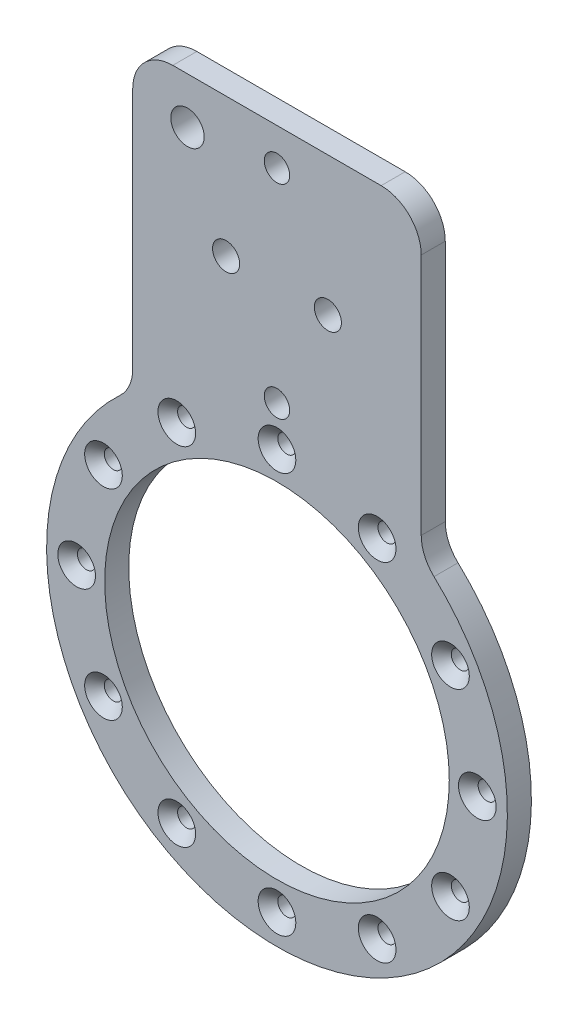
ISO-10303-21;
HEADER;
FILE_DESCRIPTION(('STEP AP214'),'2;1');
FILE_NAME('part.step','',(''),(''),'','','');
FILE_SCHEMA(('AUTOMOTIVE_DESIGN { 1 0 10303 214 1 1 1 1 }'));
ENDSEC;
DATA;
#1=APPLICATION_CONTEXT('core data for automotive mechanical design processes');
#2=APPLICATION_PROTOCOL_DEFINITION('international standard','automotive_design',2000,#1);
#3=PRODUCT_CONTEXT('',#1,'mechanical');
#4=PRODUCT('Part','Part','',(#3));
#5=PRODUCT_RELATED_PRODUCT_CATEGORY('part','',(#4));
#6=PRODUCT_DEFINITION_FORMATION('','',#4);
#7=PRODUCT_DEFINITION_CONTEXT('part definition',#1,'design');
#8=PRODUCT_DEFINITION('design','',#6,#7);
#9=PRODUCT_DEFINITION_SHAPE('','',#8);
#10=(LENGTH_UNIT() NAMED_UNIT(*) SI_UNIT(.MILLI.,.METRE.));
#11=(NAMED_UNIT(*) PLANE_ANGLE_UNIT() SI_UNIT($,.RADIAN.));
#12=(NAMED_UNIT(*) SI_UNIT($,.STERADIAN.) SOLID_ANGLE_UNIT());
#13=UNCERTAINTY_MEASURE_WITH_UNIT(LENGTH_MEASURE(1.E-05),#10,'distance_accuracy_value','');
#14=(GEOMETRIC_REPRESENTATION_CONTEXT(3) GLOBAL_UNCERTAINTY_ASSIGNED_CONTEXT((#13)) GLOBAL_UNIT_ASSIGNED_CONTEXT((#10,
#11,#12)) REPRESENTATION_CONTEXT('',''));
#15=CARTESIAN_POINT('',(0.,0.,0.));
#16=DIRECTION('',(0.,0.,1.));
#17=DIRECTION('',(1.,0.,0.));
#18=AXIS2_PLACEMENT_3D('',#15,#16,#17);
#19=CARTESIAN_POINT('',(0.,0.,3.));
#20=DIRECTION('',(0.,0.,1.));
#21=DIRECTION('',(1.,0.,0.));
#22=AXIS2_PLACEMENT_3D('',#19,#20,#21);
#23=PLANE('',#22);
#24=CARTESIAN_POINT('',(-22.335,108.435,3.));
#25=DIRECTION('',(0.,0.,-1.));
#26=DIRECTION('',(-1.,0.,0.));
#27=AXIS2_PLACEMENT_3D('',#24,#25,#26);
#28=CIRCLE('',#27,4.165);
#29=CARTESIAN_POINT('',(-26.5,108.435,3.));
#30=VERTEX_POINT('',#29);
#31=EDGE_CURVE('E604',#30,#30,#28,.T.);
#32=ORIENTED_EDGE('',*,*,#31,.T.);
#33=EDGE_LOOP('',(#32));
#34=FACE_BOUND('',#33,.T.);
#35=CARTESIAN_POINT('',(0.,50.,3.));
#36=DIRECTION('',(0.,0.,1.));
#37=DIRECTION('',(1.,0.,0.));
#38=AXIS2_PLACEMENT_3D('',#35,#36,#37);
#39=CIRCLE('',#38,4.7);
#40=CARTESIAN_POINT('',(4.7,50.,3.));
#41=VERTEX_POINT('',#40);
#42=EDGE_CURVE('E601',#41,#41,#39,.T.);
#43=ORIENTED_EDGE('',*,*,#42,.F.);
#44=EDGE_LOOP('',(#43));
#45=FACE_BOUND('',#44,.T.);
#46=CARTESIAN_POINT('',(25.,43.3012701892219,3.));
#47=DIRECTION('',(0.,0.,1.));
#48=DIRECTION('',(1.,0.,0.));
#49=AXIS2_PLACEMENT_3D('',#46,#47,#48);
#50=CIRCLE('',#49,4.7);
#51=CARTESIAN_POINT('',(29.7,43.3012701892219,3.));
#52=VERTEX_POINT('',#51);
#53=EDGE_CURVE('E595',#52,#52,#50,.T.);
#54=ORIENTED_EDGE('',*,*,#53,.F.);
#55=EDGE_LOOP('',(#54));
#56=FACE_BOUND('',#55,.T.);
#57=CARTESIAN_POINT('',(43.3012701892219,25.,3.));
#58=DIRECTION('',(0.,0.,1.));
#59=DIRECTION('',(1.,0.,0.));
#60=AXIS2_PLACEMENT_3D('',#57,#58,#59);
#61=CIRCLE('',#60,4.7);
#62=CARTESIAN_POINT('',(48.0012701892219,25.,3.));
#63=VERTEX_POINT('',#62);
#64=EDGE_CURVE('E589',#63,#63,#61,.T.);
#65=ORIENTED_EDGE('',*,*,#64,.F.);
#66=EDGE_LOOP('',(#65));
#67=FACE_BOUND('',#66,.T.);
#68=CARTESIAN_POINT('',(50.,0.,3.));
#69=DIRECTION('',(0.,0.,1.));
#70=DIRECTION('',(1.,0.,0.));
#71=AXIS2_PLACEMENT_3D('',#68,#69,#70);
#72=CIRCLE('',#71,4.7);
#73=CARTESIAN_POINT('',(54.7,0.,3.));
#74=VERTEX_POINT('',#73);
#75=EDGE_CURVE('E583',#74,#74,#72,.T.);
#76=ORIENTED_EDGE('',*,*,#75,.F.);
#77=EDGE_LOOP('',(#76));
#78=FACE_BOUND('',#77,.T.);
#79=CARTESIAN_POINT('',(43.3012701892219,-25.,3.));
#80=DIRECTION('',(0.,0.,1.));
#81=DIRECTION('',(1.,0.,0.));
#82=AXIS2_PLACEMENT_3D('',#79,#80,#81);
#83=CIRCLE('',#82,4.7);
#84=CARTESIAN_POINT('',(48.0012701892219,-25.,3.));
#85=VERTEX_POINT('',#84);
#86=EDGE_CURVE('E577',#85,#85,#83,.T.);
#87=ORIENTED_EDGE('',*,*,#86,.F.);
#88=EDGE_LOOP('',(#87));
#89=FACE_BOUND('',#88,.T.);
#90=CARTESIAN_POINT('',(25.,-43.3012701892219,3.));
#91=DIRECTION('',(0.,0.,1.));
#92=DIRECTION('',(1.,0.,0.));
#93=AXIS2_PLACEMENT_3D('',#90,#91,#92);
#94=CIRCLE('',#93,4.7);
#95=CARTESIAN_POINT('',(29.7,-43.3012701892219,3.));
#96=VERTEX_POINT('',#95);
#97=EDGE_CURVE('E571',#96,#96,#94,.T.);
#98=ORIENTED_EDGE('',*,*,#97,.F.);
#99=EDGE_LOOP('',(#98));
#100=FACE_BOUND('',#99,.T.);
#101=CARTESIAN_POINT('',(0.,-50.,3.));
#102=DIRECTION('',(0.,0.,1.));
#103=DIRECTION('',(1.,0.,0.));
#104=AXIS2_PLACEMENT_3D('',#101,#102,#103);
#105=CIRCLE('',#104,4.7);
#106=CARTESIAN_POINT('',(4.7,-50.,3.));
#107=VERTEX_POINT('',#106);
#108=EDGE_CURVE('E565',#107,#107,#105,.T.);
#109=ORIENTED_EDGE('',*,*,#108,.F.);
#110=EDGE_LOOP('',(#109));
#111=FACE_BOUND('',#110,.T.);
#112=CARTESIAN_POINT('',(-25.,-43.3012701892219,3.));
#113=DIRECTION('',(0.,0.,1.));
#114=DIRECTION('',(1.,0.,0.));
#115=AXIS2_PLACEMENT_3D('',#112,#113,#114);
#116=CIRCLE('',#115,4.7);
#117=CARTESIAN_POINT('',(-20.3,-43.3012701892219,3.));
#118=VERTEX_POINT('',#117);
#119=EDGE_CURVE('E559',#118,#118,#116,.T.);
#120=ORIENTED_EDGE('',*,*,#119,.F.);
#121=EDGE_LOOP('',(#120));
#122=FACE_BOUND('',#121,.T.);
#123=CARTESIAN_POINT('',(-43.3012701892219,-25.,3.));
#124=DIRECTION('',(0.,0.,1.));
#125=DIRECTION('',(1.,0.,0.));
#126=AXIS2_PLACEMENT_3D('',#123,#124,#125);
#127=CIRCLE('',#126,4.7);
#128=CARTESIAN_POINT('',(-38.6012701892219,-25.,3.));
#129=VERTEX_POINT('',#128);
#130=EDGE_CURVE('E553',#129,#129,#127,.T.);
#131=ORIENTED_EDGE('',*,*,#130,.F.);
#132=EDGE_LOOP('',(#131));
#133=FACE_BOUND('',#132,.T.);
#134=CARTESIAN_POINT('',(-50.,0.,3.));
#135=DIRECTION('',(0.,0.,1.));
#136=DIRECTION('',(1.,0.,0.));
#137=AXIS2_PLACEMENT_3D('',#134,#135,#136);
#138=CIRCLE('',#137,4.7);
#139=CARTESIAN_POINT('',(-45.3,0.,3.));
#140=VERTEX_POINT('',#139);
#141=EDGE_CURVE('E547',#140,#140,#138,.T.);
#142=ORIENTED_EDGE('',*,*,#141,.F.);
#143=EDGE_LOOP('',(#142));
#144=FACE_BOUND('',#143,.T.);
#145=CARTESIAN_POINT('',(-43.301270189222,25.,3.));
#146=DIRECTION('',(0.,0.,1.));
#147=DIRECTION('',(1.,0.,0.));
#148=AXIS2_PLACEMENT_3D('',#145,#146,#147);
#149=CIRCLE('',#148,4.7);
#150=CARTESIAN_POINT('',(-38.6012701892219,25.,3.));
#151=VERTEX_POINT('',#150);
#152=EDGE_CURVE('E541',#151,#151,#149,.T.);
#153=ORIENTED_EDGE('',*,*,#152,.F.);
#154=EDGE_LOOP('',(#153));
#155=FACE_BOUND('',#154,.T.);
#156=CARTESIAN_POINT('',(-25.,43.3012701892219,3.));
#157=DIRECTION('',(0.,0.,1.));
#158=DIRECTION('',(1.,0.,0.));
#159=AXIS2_PLACEMENT_3D('',#156,#157,#158);
#160=CIRCLE('',#159,4.7);
#161=CARTESIAN_POINT('',(-20.3,43.3012701892219,3.));
#162=VERTEX_POINT('',#161);
#163=EDGE_CURVE('E535',#162,#162,#160,.T.);
#164=ORIENTED_EDGE('',*,*,#163,.F.);
#165=EDGE_LOOP('',(#164));
#166=FACE_BOUND('',#165,.T.);
#167=CARTESIAN_POINT('',(-12.7,85.4,3.));
#168=DIRECTION('',(0.,0.,1.));
#169=DIRECTION('',(1.,0.,0.));
#170=AXIS2_PLACEMENT_3D('',#167,#168,#169);
#171=CIRCLE('',#170,3.3782);
#172=CARTESIAN_POINT('',(-9.3218,85.4,3.));
#173=VERTEX_POINT('',#172);
#174=EDGE_CURVE('E531',#173,#173,#171,.T.);
#175=ORIENTED_EDGE('',*,*,#174,.F.);
#176=EDGE_LOOP('',(#175));
#177=FACE_BOUND('',#176,.T.);
#178=CARTESIAN_POINT('',(12.7,85.4,3.));
#179=DIRECTION('',(0.,0.,1.));
#180=DIRECTION('',(1.,0.,0.));
#181=AXIS2_PLACEMENT_3D('',#178,#179,#180);
#182=CIRCLE('',#181,3.3782);
#183=CARTESIAN_POINT('',(16.0782,85.4,3.));
#184=VERTEX_POINT('',#183);
#185=EDGE_CURVE('E525',#184,#184,#182,.T.);
#186=ORIENTED_EDGE('',*,*,#185,.F.);
#187=EDGE_LOOP('',(#186));
#188=FACE_BOUND('',#187,.T.);
#189=CARTESIAN_POINT('',(0.,60.,3.));
#190=DIRECTION('',(0.,0.,1.));
#191=DIRECTION('',(1.,0.,0.));
#192=AXIS2_PLACEMENT_3D('',#189,#190,#191);
#193=CIRCLE('',#192,3.175);
#194=CARTESIAN_POINT('',(3.175,60.,3.));
#195=VERTEX_POINT('',#194);
#196=EDGE_CURVE('E519',#195,#195,#193,.T.);
#197=ORIENTED_EDGE('',*,*,#196,.F.);
#198=EDGE_LOOP('',(#197));
#199=FACE_BOUND('',#198,.T.);
#200=CARTESIAN_POINT('',(0.,110.8,3.));
#201=DIRECTION('',(0.,0.,1.));
#202=DIRECTION('',(1.,0.,0.));
#203=AXIS2_PLACEMENT_3D('',#200,#201,#202);
#204=CIRCLE('',#203,3.175);
#205=CARTESIAN_POINT('',(3.175,110.8,3.));
#206=VERTEX_POINT('',#205);
#207=EDGE_CURVE('E513',#206,#206,#204,.T.);
#208=ORIENTED_EDGE('',*,*,#207,.F.);
#209=EDGE_LOOP('',(#208));
#210=FACE_BOUND('',#209,.T.);
#211=DIRECTION('',(0.,1.,0.));
#212=VECTOR('',#211,1.);
#213=CARTESIAN_POINT('',(36.,120.,3.));
#214=LINE('',#213,#212);
#215=CARTESIAN_POINT('',(36.,49.3988866271295,3.));
#216=VERTEX_POINT('',#215);
#217=CARTESIAN_POINT('',(36.,110.,3.));
#218=VERTEX_POINT('',#217);
#219=EDGE_CURVE('E175',#216,#218,#214,.T.);
#220=ORIENTED_EDGE('',*,*,#219,.T.);
#221=CARTESIAN_POINT('',(26.,110.,3.));
#222=DIRECTION('',(0.,0.,1.));
#223=DIRECTION('',(1.,0.,0.));
#224=AXIS2_PLACEMENT_3D('',#221,#222,#223);
#225=CIRCLE('',#224,10.);
#226=CARTESIAN_POINT('',(26.,120.,3.));
#227=VERTEX_POINT('',#226);
#228=EDGE_CURVE('E146',#218,#227,#225,.T.);
#229=ORIENTED_EDGE('',*,*,#228,.T.);
#230=DIRECTION('',(-1.,0.,0.));
#231=VECTOR('',#230,1.);
#232=CARTESIAN_POINT('',(-36.,120.,3.));
#233=LINE('',#232,#231);
#234=CARTESIAN_POINT('',(-26.,120.,3.));
#235=VERTEX_POINT('',#234);
#236=EDGE_CURVE('E124',#227,#235,#233,.T.);
#237=ORIENTED_EDGE('',*,*,#236,.T.);
#238=CARTESIAN_POINT('',(-26.,110.,3.));
#239=DIRECTION('',(0.,0.,1.));
#240=DIRECTION('',(1.,0.,0.));
#241=AXIS2_PLACEMENT_3D('',#238,#239,#240);
#242=CIRCLE('',#241,10.);
#243=CARTESIAN_POINT('',(-36.,110.,3.));
#244=VERTEX_POINT('',#243);
#245=EDGE_CURVE('E61',#235,#244,#242,.T.);
#246=ORIENTED_EDGE('',*,*,#245,.T.);
#247=DIRECTION('',(0.,-1.,0.));
#248=VECTOR('',#247,1.);
#249=CARTESIAN_POINT('',(-36.,44.8358115795845,3.));
#250=LINE('',#249,#248);
#251=CARTESIAN_POINT('',(-36.,49.3988866271295,3.));
#252=VERTEX_POINT('',#251);
#253=EDGE_CURVE('E139',#244,#252,#250,.T.);
#254=ORIENTED_EDGE('',*,*,#253,.T.);
#255=CARTESIAN_POINT('',(-46.,49.3988866271295,3.));
#256=DIRECTION('',(0.,0.,1.));
#257=DIRECTION('',(1.,0.,0.));
#258=AXIS2_PLACEMENT_3D('',#255,#256,#257);
#259=CIRCLE('',#258,10.);
#260=CARTESIAN_POINT('',(-39.1851851851852,42.08053305274,3.));
#261=VERTEX_POINT('',#260);
#262=EDGE_CURVE('E159',#252,#261,#259,.F.);
#263=ORIENTED_EDGE('',*,*,#262,.T.);
#264=CARTESIAN_POINT('',(0.,0.,3.));
#265=DIRECTION('',(0.,0.,1.));
#266=DIRECTION('',(1.,0.,0.));
#267=AXIS2_PLACEMENT_3D('',#264,#265,#266);
#268=CIRCLE('',#267,57.5);
#269=CARTESIAN_POINT('',(39.1851851851852,42.08053305274,3.));
#270=VERTEX_POINT('',#269);
#271=EDGE_CURVE('E133',#261,#270,#268,.T.);
#272=ORIENTED_EDGE('',*,*,#271,.T.);
#273=CARTESIAN_POINT('',(46.,49.3988866271295,3.));
#274=DIRECTION('',(0.,0.,1.));
#275=DIRECTION('',(1.,0.,0.));
#276=AXIS2_PLACEMENT_3D('',#273,#274,#275);
#277=CIRCLE('',#276,10.);
#278=EDGE_CURVE('E11',#270,#216,#277,.F.);
#279=ORIENTED_EDGE('',*,*,#278,.T.);
#280=EDGE_LOOP('',(#220,#229,#237,#246,#254,#263,#272,#279));
#281=FACE_BOUND('',#280,.T.);
#282=CARTESIAN_POINT('',(0.,0.,3.));
#283=DIRECTION('',(0.,0.,1.));
#284=DIRECTION('',(1.,0.,0.));
#285=AXIS2_PLACEMENT_3D('',#282,#283,#284);
#286=CIRCLE('',#285,43.);
#287=CARTESIAN_POINT('',(43.,0.,3.));
#288=VERTEX_POINT('',#287);
#289=EDGE_CURVE('E170',#288,#288,#286,.T.);
#290=ORIENTED_EDGE('',*,*,#289,.F.);
#291=EDGE_LOOP('',(#290));
#292=FACE_BOUND('',#291,.T.);
#293=ADVANCED_FACE('F39',(#34,#45,#56,#67,#78,#89,#100,#111,#122,#133,#144,#155,#166,#177,#188,
#199,#210,#281,#292),#23,.T.);
#294=CARTESIAN_POINT('',(0.,0.,-3.));
#295=DIRECTION('',(0.,0.,1.));
#296=DIRECTION('',(1.,0.,0.));
#297=AXIS2_PLACEMENT_3D('',#294,#295,#296);
#298=PLANE('',#297);
#299=CARTESIAN_POINT('',(-22.335,108.435,-3.));
#300=DIRECTION('',(0.,0.,-1.));
#301=DIRECTION('',(-1.,0.,0.));
#302=AXIS2_PLACEMENT_3D('',#299,#300,#301);
#303=CIRCLE('',#302,4.165);
#304=CARTESIAN_POINT('',(-26.5,108.435,-3.));
#305=VERTEX_POINT('',#304);
#306=EDGE_CURVE('E605',#305,#305,#303,.T.);
#307=ORIENTED_EDGE('',*,*,#306,.F.);
#308=EDGE_LOOP('',(#307));
#309=FACE_BOUND('',#308,.T.);
#310=CARTESIAN_POINT('',(-12.7,85.4,-3.));
#311=DIRECTION('',(0.,0.,1.));
#312=DIRECTION('',(1.,0.,0.));
#313=AXIS2_PLACEMENT_3D('',#310,#311,#312);
#314=CIRCLE('',#313,3.3782);
#315=CARTESIAN_POINT('',(-9.3218,85.4,-3.));
#316=VERTEX_POINT('',#315);
#317=EDGE_CURVE('E528',#316,#316,#314,.T.);
#318=ORIENTED_EDGE('',*,*,#317,.T.);
#319=EDGE_LOOP('',(#318));
#320=FACE_BOUND('',#319,.T.);
#321=CARTESIAN_POINT('',(12.7,85.4,-3.));
#322=DIRECTION('',(0.,0.,1.));
#323=DIRECTION('',(1.,0.,0.));
#324=AXIS2_PLACEMENT_3D('',#321,#322,#323);
#325=CIRCLE('',#324,3.3782);
#326=CARTESIAN_POINT('',(16.0782,85.4,-3.));
#327=VERTEX_POINT('',#326);
#328=EDGE_CURVE('E522',#327,#327,#325,.T.);
#329=ORIENTED_EDGE('',*,*,#328,.T.);
#330=EDGE_LOOP('',(#329));
#331=FACE_BOUND('',#330,.T.);
#332=CARTESIAN_POINT('',(0.,60.,-3.));
#333=DIRECTION('',(0.,0.,1.));
#334=DIRECTION('',(1.,0.,0.));
#335=AXIS2_PLACEMENT_3D('',#332,#333,#334);
#336=CIRCLE('',#335,3.175);
#337=CARTESIAN_POINT('',(3.175,60.,-3.));
#338=VERTEX_POINT('',#337);
#339=EDGE_CURVE('E516',#338,#338,#336,.T.);
#340=ORIENTED_EDGE('',*,*,#339,.T.);
#341=EDGE_LOOP('',(#340));
#342=FACE_BOUND('',#341,.T.);
#343=CARTESIAN_POINT('',(0.,110.8,-3.));
#344=DIRECTION('',(0.,0.,1.));
#345=DIRECTION('',(1.,0.,0.));
#346=AXIS2_PLACEMENT_3D('',#343,#344,#345);
#347=CIRCLE('',#346,3.175);
#348=CARTESIAN_POINT('',(3.175,110.8,-3.));
#349=VERTEX_POINT('',#348);
#350=EDGE_CURVE('E510',#349,#349,#347,.T.);
#351=ORIENTED_EDGE('',*,*,#350,.T.);
#352=EDGE_LOOP('',(#351));
#353=FACE_BOUND('',#352,.T.);
#354=CARTESIAN_POINT('',(0.,50.,-3.));
#355=DIRECTION('',(0.,0.,1.));
#356=DIRECTION('',(1.,0.,0.));
#357=AXIS2_PLACEMENT_3D('',#354,#355,#356);
#358=CIRCLE('',#357,2.25);
#359=CARTESIAN_POINT('',(2.25,50.,-3.));
#360=VERTEX_POINT('',#359);
#361=EDGE_CURVE('E507',#360,#360,#358,.T.);
#362=ORIENTED_EDGE('',*,*,#361,.T.);
#363=EDGE_LOOP('',(#362));
#364=FACE_BOUND('',#363,.T.);
#365=CARTESIAN_POINT('',(25.,43.3012701892219,-3.));
#366=DIRECTION('',(0.,0.,1.));
#367=DIRECTION('',(1.,0.,0.));
#368=AXIS2_PLACEMENT_3D('',#365,#366,#367);
#369=CIRCLE('',#368,2.25);
#370=CARTESIAN_POINT('',(27.25,43.3012701892219,-3.));
#371=VERTEX_POINT('',#370);
#372=EDGE_CURVE('E504',#371,#371,#369,.T.);
#373=ORIENTED_EDGE('',*,*,#372,.T.);
#374=EDGE_LOOP('',(#373));
#375=FACE_BOUND('',#374,.T.);
#376=CARTESIAN_POINT('',(43.3012701892219,25.,-3.));
#377=DIRECTION('',(0.,0.,1.));
#378=DIRECTION('',(1.,0.,0.));
#379=AXIS2_PLACEMENT_3D('',#376,#377,#378);
#380=CIRCLE('',#379,2.25);
#381=CARTESIAN_POINT('',(45.5512701892219,25.,-3.));
#382=VERTEX_POINT('',#381);
#383=EDGE_CURVE('E501',#382,#382,#380,.T.);
#384=ORIENTED_EDGE('',*,*,#383,.T.);
#385=EDGE_LOOP('',(#384));
#386=FACE_BOUND('',#385,.T.);
#387=CARTESIAN_POINT('',(50.,0.,-3.));
#388=DIRECTION('',(0.,0.,1.));
#389=DIRECTION('',(1.,0.,0.));
#390=AXIS2_PLACEMENT_3D('',#387,#388,#389);
#391=CIRCLE('',#390,2.25);
#392=CARTESIAN_POINT('',(52.25,0.,-3.));
#393=VERTEX_POINT('',#392);
#394=EDGE_CURVE('E498',#393,#393,#391,.T.);
#395=ORIENTED_EDGE('',*,*,#394,.T.);
#396=EDGE_LOOP('',(#395));
#397=FACE_BOUND('',#396,.T.);
#398=CARTESIAN_POINT('',(43.3012701892219,-25.,-3.));
#399=DIRECTION('',(0.,0.,1.));
#400=DIRECTION('',(1.,0.,0.));
#401=AXIS2_PLACEMENT_3D('',#398,#399,#400);
#402=CIRCLE('',#401,2.25);
#403=CARTESIAN_POINT('',(45.5512701892219,-25.,-3.));
#404=VERTEX_POINT('',#403);
#405=EDGE_CURVE('E495',#404,#404,#402,.T.);
#406=ORIENTED_EDGE('',*,*,#405,.T.);
#407=EDGE_LOOP('',(#406));
#408=FACE_BOUND('',#407,.T.);
#409=CARTESIAN_POINT('',(25.,-43.3012701892219,-3.));
#410=DIRECTION('',(0.,0.,1.));
#411=DIRECTION('',(1.,0.,0.));
#412=AXIS2_PLACEMENT_3D('',#409,#410,#411);
#413=CIRCLE('',#412,2.25);
#414=CARTESIAN_POINT('',(27.25,-43.3012701892219,-3.));
#415=VERTEX_POINT('',#414);
#416=EDGE_CURVE('E492',#415,#415,#413,.T.);
#417=ORIENTED_EDGE('',*,*,#416,.T.);
#418=EDGE_LOOP('',(#417));
#419=FACE_BOUND('',#418,.T.);
#420=CARTESIAN_POINT('',(0.,-50.,-3.));
#421=DIRECTION('',(0.,0.,1.));
#422=DIRECTION('',(1.,0.,0.));
#423=AXIS2_PLACEMENT_3D('',#420,#421,#422);
#424=CIRCLE('',#423,2.25);
#425=CARTESIAN_POINT('',(2.25,-50.,-3.));
#426=VERTEX_POINT('',#425);
#427=EDGE_CURVE('E489',#426,#426,#424,.T.);
#428=ORIENTED_EDGE('',*,*,#427,.T.);
#429=EDGE_LOOP('',(#428));
#430=FACE_BOUND('',#429,.T.);
#431=CARTESIAN_POINT('',(-25.,-43.3012701892219,-3.));
#432=DIRECTION('',(0.,0.,1.));
#433=DIRECTION('',(1.,0.,0.));
#434=AXIS2_PLACEMENT_3D('',#431,#432,#433);
#435=CIRCLE('',#434,2.25);
#436=CARTESIAN_POINT('',(-22.75,-43.3012701892219,-3.));
#437=VERTEX_POINT('',#436);
#438=EDGE_CURVE('E486',#437,#437,#435,.T.);
#439=ORIENTED_EDGE('',*,*,#438,.T.);
#440=EDGE_LOOP('',(#439));
#441=FACE_BOUND('',#440,.T.);
#442=CARTESIAN_POINT('',(-43.3012701892219,-25.,-3.));
#443=DIRECTION('',(0.,0.,1.));
#444=DIRECTION('',(1.,0.,0.));
#445=AXIS2_PLACEMENT_3D('',#442,#443,#444);
#446=CIRCLE('',#445,2.25);
#447=CARTESIAN_POINT('',(-41.0512701892219,-25.,-3.));
#448=VERTEX_POINT('',#447);
#449=EDGE_CURVE('E483',#448,#448,#446,.T.);
#450=ORIENTED_EDGE('',*,*,#449,.T.);
#451=EDGE_LOOP('',(#450));
#452=FACE_BOUND('',#451,.T.);
#453=CARTESIAN_POINT('',(-50.,0.,-3.));
#454=DIRECTION('',(0.,0.,1.));
#455=DIRECTION('',(1.,0.,0.));
#456=AXIS2_PLACEMENT_3D('',#453,#454,#455);
#457=CIRCLE('',#456,2.25);
#458=CARTESIAN_POINT('',(-47.75,0.,-3.));
#459=VERTEX_POINT('',#458);
#460=EDGE_CURVE('E473',#459,#459,#457,.T.);
#461=ORIENTED_EDGE('',*,*,#460,.T.);
#462=EDGE_LOOP('',(#461));
#463=FACE_BOUND('',#462,.T.);
#464=CARTESIAN_POINT('',(-43.301270189222,25.,-3.));
#465=DIRECTION('',(0.,0.,1.));
#466=DIRECTION('',(1.,0.,0.));
#467=AXIS2_PLACEMENT_3D('',#464,#465,#466);
#468=CIRCLE('',#467,2.25);
#469=CARTESIAN_POINT('',(-41.051270189222,25.,-3.));
#470=VERTEX_POINT('',#469);
#471=EDGE_CURVE('E469',#470,#470,#468,.T.);
#472=ORIENTED_EDGE('',*,*,#471,.T.);
#473=EDGE_LOOP('',(#472));
#474=FACE_BOUND('',#473,.T.);
#475=CARTESIAN_POINT('',(-25.,43.3012701892219,-3.));
#476=DIRECTION('',(0.,0.,1.));
#477=DIRECTION('',(1.,0.,0.));
#478=AXIS2_PLACEMENT_3D('',#475,#476,#477);
#479=CIRCLE('',#478,2.25);
#480=CARTESIAN_POINT('',(-22.75,43.3012701892219,-3.));
#481=VERTEX_POINT('',#480);
#482=EDGE_CURVE('E466',#481,#481,#479,.T.);
#483=ORIENTED_EDGE('',*,*,#482,.T.);
#484=EDGE_LOOP('',(#483));
#485=FACE_BOUND('',#484,.T.);
#486=DIRECTION('',(-1.,0.,0.));
#487=VECTOR('',#486,1.);
#488=CARTESIAN_POINT('',(-36.,120.,-3.));
#489=LINE('',#488,#487);
#490=CARTESIAN_POINT('',(26.,120.,-3.));
#491=VERTEX_POINT('',#490);
#492=CARTESIAN_POINT('',(-26.,120.,-3.));
#493=VERTEX_POINT('',#492);
#494=EDGE_CURVE('E122',#491,#493,#489,.T.);
#495=ORIENTED_EDGE('',*,*,#494,.F.);
#496=CARTESIAN_POINT('',(26.,110.,-3.));
#497=DIRECTION('',(0.,0.,1.));
#498=DIRECTION('',(1.,0.,0.));
#499=AXIS2_PLACEMENT_3D('',#496,#497,#498);
#500=CIRCLE('',#499,10.);
#501=CARTESIAN_POINT('',(36.,110.,-3.));
#502=VERTEX_POINT('',#501);
#503=EDGE_CURVE('E105',#491,#502,#500,.F.);
#504=ORIENTED_EDGE('',*,*,#503,.T.);
#505=DIRECTION('',(0.,1.,0.));
#506=VECTOR('',#505,1.);
#507=CARTESIAN_POINT('',(36.,120.,-3.));
#508=LINE('',#507,#506);
#509=CARTESIAN_POINT('',(36.,49.3988866271295,-3.));
#510=VERTEX_POINT('',#509);
#511=EDGE_CURVE('E131',#510,#502,#508,.T.);
#512=ORIENTED_EDGE('',*,*,#511,.F.);
#513=CARTESIAN_POINT('',(46.,49.3988866271295,-3.));
#514=DIRECTION('',(0.,0.,1.));
#515=DIRECTION('',(1.,0.,0.));
#516=AXIS2_PLACEMENT_3D('',#513,#514,#515);
#517=CIRCLE('',#516,10.);
#518=CARTESIAN_POINT('',(39.1851851851852,42.08053305274,-3.));
#519=VERTEX_POINT('',#518);
#520=EDGE_CURVE('E47',#510,#519,#517,.T.);
#521=ORIENTED_EDGE('',*,*,#520,.T.);
#522=CARTESIAN_POINT('',(0.,0.,-3.));
#523=DIRECTION('',(0.,0.,1.));
#524=DIRECTION('',(1.,0.,0.));
#525=AXIS2_PLACEMENT_3D('',#522,#523,#524);
#526=CIRCLE('',#525,57.5);
#527=CARTESIAN_POINT('',(-39.1851851851852,42.08053305274,-3.));
#528=VERTEX_POINT('',#527);
#529=EDGE_CURVE('E135',#528,#519,#526,.T.);
#530=ORIENTED_EDGE('',*,*,#529,.F.);
#531=CARTESIAN_POINT('',(-46.,49.3988866271295,-3.));
#532=DIRECTION('',(0.,0.,1.));
#533=DIRECTION('',(1.,0.,0.));
#534=AXIS2_PLACEMENT_3D('',#531,#532,#533);
#535=CIRCLE('',#534,10.);
#536=CARTESIAN_POINT('',(-36.,49.3988866271295,-3.));
#537=VERTEX_POINT('',#536);
#538=EDGE_CURVE('E157',#528,#537,#535,.T.);
#539=ORIENTED_EDGE('',*,*,#538,.T.);
#540=DIRECTION('',(0.,-1.,0.));
#541=VECTOR('',#540,1.);
#542=CARTESIAN_POINT('',(-36.,44.8358115795845,-3.));
#543=LINE('',#542,#541);
#544=CARTESIAN_POINT('',(-36.,110.,-3.));
#545=VERTEX_POINT('',#544);
#546=EDGE_CURVE('E130',#545,#537,#543,.T.);
#547=ORIENTED_EDGE('',*,*,#546,.F.);
#548=CARTESIAN_POINT('',(-26.,110.,-3.));
#549=DIRECTION('',(0.,0.,1.));
#550=DIRECTION('',(1.,0.,0.));
#551=AXIS2_PLACEMENT_3D('',#548,#549,#550);
#552=CIRCLE('',#551,10.);
#553=EDGE_CURVE('E116',#545,#493,#552,.F.);
#554=ORIENTED_EDGE('',*,*,#553,.T.);
#555=EDGE_LOOP('',(#495,#504,#512,#521,#530,#539,#547,#554));
#556=FACE_BOUND('',#555,.T.);
#557=CARTESIAN_POINT('',(0.,0.,-3.));
#558=DIRECTION('',(0.,0.,1.));
#559=DIRECTION('',(1.,0.,0.));
#560=AXIS2_PLACEMENT_3D('',#557,#558,#559);
#561=CIRCLE('',#560,43.);
#562=CARTESIAN_POINT('',(43.,0.,-3.));
#563=VERTEX_POINT('',#562);
#564=EDGE_CURVE('E468',#563,#563,#561,.T.);
#565=ORIENTED_EDGE('',*,*,#564,.T.);
#566=EDGE_LOOP('',(#565));
#567=FACE_BOUND('',#566,.T.);
#568=ADVANCED_FACE('F127',(#309,#320,#331,#342,#353,#364,#375,#386,#397,#408,#419,#430,#441,
#452,#463,#474,#485,#556,#567),#298,.F.);
#569=CARTESIAN_POINT('',(0.,0.,3.));
#570=DIRECTION('',(0.,0.,-1.));
#571=DIRECTION('',(-1.,0.,0.));
#572=AXIS2_PLACEMENT_3D('',#569,#570,#571);
#573=CYLINDRICAL_SURFACE('',#572,57.5);
#574=ORIENTED_EDGE('',*,*,#271,.F.);
#575=DIRECTION('',(0.,0.,-1.));
#576=VECTOR('',#575,1.);
#577=CARTESIAN_POINT('',(-39.1851851851852,42.08053305274,3.));
#578=LINE('',#577,#576);
#579=EDGE_CURVE('E154',#261,#528,#578,.T.);
#580=ORIENTED_EDGE('',*,*,#579,.T.);
#581=ORIENTED_EDGE('',*,*,#529,.T.);
#582=DIRECTION('',(0.,0.,-1.));
#583=VECTOR('',#582,1.);
#584=CARTESIAN_POINT('',(39.1851851851852,42.08053305274,3.));
#585=LINE('',#584,#583);
#586=EDGE_CURVE('E152',#519,#270,#585,.F.);
#587=ORIENTED_EDGE('',*,*,#586,.T.);
#588=EDGE_LOOP('',(#574,#580,#581,#587));
#589=FACE_BOUND('',#588,.T.);
#590=ADVANCED_FACE('F167',(#589),#573,.T.);
#591=CARTESIAN_POINT('',(36.,120.,3.));
#592=DIRECTION('',(-1.,0.,0.));
#593=DIRECTION('',(0.,-1.,0.));
#594=AXIS2_PLACEMENT_3D('',#591,#592,#593);
#595=PLANE('',#594);
#596=ORIENTED_EDGE('',*,*,#511,.T.);
#597=DIRECTION('',(0.,0.,-1.));
#598=VECTOR('',#597,1.);
#599=CARTESIAN_POINT('',(36.,110.,3.));
#600=LINE('',#599,#598);
#601=EDGE_CURVE('E110',#502,#218,#600,.F.);
#602=ORIENTED_EDGE('',*,*,#601,.T.);
#603=ORIENTED_EDGE('',*,*,#219,.F.);
#604=DIRECTION('',(0.,0.,1.));
#605=VECTOR('',#604,1.);
#606=CARTESIAN_POINT('',(36.,49.3988866271295,-3.));
#607=LINE('',#606,#605);
#608=EDGE_CURVE('E115',#216,#510,#607,.F.);
#609=ORIENTED_EDGE('',*,*,#608,.T.);
#610=EDGE_LOOP('',(#596,#602,#603,#609));
#611=FACE_BOUND('',#610,.T.);
#612=ADVANCED_FACE('F177',(#611),#595,.F.);
#613=CARTESIAN_POINT('',(-36.,120.,3.));
#614=DIRECTION('',(0.,-1.,0.));
#615=DIRECTION('',(0.,0.,-1.));
#616=AXIS2_PLACEMENT_3D('',#613,#614,#615);
#617=PLANE('',#616);
#618=ORIENTED_EDGE('',*,*,#236,.F.);
#619=DIRECTION('',(0.,0.,-1.));
#620=VECTOR('',#619,1.);
#621=CARTESIAN_POINT('',(26.,120.,3.));
#622=LINE('',#621,#620);
#623=EDGE_CURVE('E109',#227,#491,#622,.T.);
#624=ORIENTED_EDGE('',*,*,#623,.T.);
#625=ORIENTED_EDGE('',*,*,#494,.T.);
#626=DIRECTION('',(0.,0.,-1.));
#627=VECTOR('',#626,1.);
#628=CARTESIAN_POINT('',(-26.,120.,3.));
#629=LINE('',#628,#627);
#630=EDGE_CURVE('E125',#493,#235,#629,.F.);
#631=ORIENTED_EDGE('',*,*,#630,.T.);
#632=EDGE_LOOP('',(#618,#624,#625,#631));
#633=FACE_BOUND('',#632,.T.);
#634=ADVANCED_FACE('F121',(#633),#617,.F.);
#635=CARTESIAN_POINT('',(-36.,44.8358115795845,3.));
#636=DIRECTION('',(1.,0.,0.));
#637=DIRECTION('',(0.,1.,0.));
#638=AXIS2_PLACEMENT_3D('',#635,#636,#637);
#639=PLANE('',#638);
#640=ORIENTED_EDGE('',*,*,#253,.F.);
#641=DIRECTION('',(0.,0.,-1.));
#642=VECTOR('',#641,1.);
#643=CARTESIAN_POINT('',(-36.,110.,3.));
#644=LINE('',#643,#642);
#645=EDGE_CURVE('E149',#244,#545,#644,.T.);
#646=ORIENTED_EDGE('',*,*,#645,.T.);
#647=ORIENTED_EDGE('',*,*,#546,.T.);
#648=DIRECTION('',(0.,0.,1.));
#649=VECTOR('',#648,1.);
#650=CARTESIAN_POINT('',(-36.,49.3988866271295,3.));
#651=LINE('',#650,#649);
#652=EDGE_CURVE('E54',#537,#252,#651,.T.);
#653=ORIENTED_EDGE('',*,*,#652,.T.);
#654=EDGE_LOOP('',(#640,#646,#647,#653));
#655=FACE_BOUND('',#654,.T.);
#656=ADVANCED_FACE('F187',(#655),#639,.F.);
#657=CARTESIAN_POINT('',(0.,0.,3.));
#658=DIRECTION('',(0.,0.,-1.));
#659=DIRECTION('',(-1.,0.,0.));
#660=AXIS2_PLACEMENT_3D('',#657,#658,#659);
#661=CYLINDRICAL_SURFACE('',#660,43.);
#662=ORIENTED_EDGE('',*,*,#289,.T.);
#663=EDGE_LOOP('',(#662));
#664=FACE_BOUND('',#663,.T.);
#665=ORIENTED_EDGE('',*,*,#564,.F.);
#666=EDGE_LOOP('',(#665));
#667=FACE_BOUND('',#666,.T.);
#668=ADVANCED_FACE('F210',(#664,#667),#661,.F.);
#669=CARTESIAN_POINT('',(-25.,43.3012701892219,3.));
#670=DIRECTION('',(0.,0.,1.));
#671=DIRECTION('',(1.,0.,0.));
#672=AXIS2_PLACEMENT_3D('',#669,#670,#671);
#673=CYLINDRICAL_SURFACE('',#672,2.24999999999999);
#674=CARTESIAN_POINT('',(-25.,43.3012701892219,0.55));
#675=DIRECTION('',(0.,0.,1.));
#676=DIRECTION('',(1.,0.,0.));
#677=AXIS2_PLACEMENT_3D('',#674,#675,#676);
#678=CIRCLE('',#677,2.25);
#679=CARTESIAN_POINT('',(-22.75,43.3012701892219,0.55));
#680=VERTEX_POINT('',#679);
#681=EDGE_CURVE('E463',#680,#680,#678,.T.);
#682=ORIENTED_EDGE('',*,*,#681,.T.);
#683=EDGE_LOOP('',(#682));
#684=FACE_BOUND('',#683,.T.);
#685=ORIENTED_EDGE('',*,*,#482,.F.);
#686=EDGE_LOOP('',(#685));
#687=FACE_BOUND('',#686,.T.);
#688=ADVANCED_FACE('F453',(#684,#687),#673,.F.);
#689=CARTESIAN_POINT('',(-43.301270189222,25.,3.));
#690=DIRECTION('',(0.,0.,1.));
#691=DIRECTION('',(1.,0.,0.));
#692=AXIS2_PLACEMENT_3D('',#689,#690,#691);
#693=CYLINDRICAL_SURFACE('',#692,2.25);
#694=CARTESIAN_POINT('',(-43.301270189222,25.,0.55));
#695=DIRECTION('',(0.,0.,1.));
#696=DIRECTION('',(1.,0.,0.));
#697=AXIS2_PLACEMENT_3D('',#694,#695,#696);
#698=CIRCLE('',#697,2.25);
#699=CARTESIAN_POINT('',(-41.051270189222,25.,0.55));
#700=VERTEX_POINT('',#699);
#701=EDGE_CURVE('E538',#700,#700,#698,.T.);
#702=ORIENTED_EDGE('',*,*,#701,.T.);
#703=EDGE_LOOP('',(#702));
#704=FACE_BOUND('',#703,.T.);
#705=ORIENTED_EDGE('',*,*,#471,.F.);
#706=EDGE_LOOP('',(#705));
#707=FACE_BOUND('',#706,.T.);
#708=ADVANCED_FACE('F450',(#704,#707),#693,.F.);
#709=CARTESIAN_POINT('',(-50.,0.,3.));
#710=DIRECTION('',(0.,0.,1.));
#711=DIRECTION('',(1.,0.,0.));
#712=AXIS2_PLACEMENT_3D('',#709,#710,#711);
#713=CYLINDRICAL_SURFACE('',#712,2.25);
#714=CARTESIAN_POINT('',(-50.,0.,0.55));
#715=DIRECTION('',(0.,0.,1.));
#716=DIRECTION('',(1.,0.,0.));
#717=AXIS2_PLACEMENT_3D('',#714,#715,#716);
#718=CIRCLE('',#717,2.25);
#719=CARTESIAN_POINT('',(-47.75,0.,0.55));
#720=VERTEX_POINT('',#719);
#721=EDGE_CURVE('E544',#720,#720,#718,.T.);
#722=ORIENTED_EDGE('',*,*,#721,.T.);
#723=EDGE_LOOP('',(#722));
#724=FACE_BOUND('',#723,.T.);
#725=ORIENTED_EDGE('',*,*,#460,.F.);
#726=EDGE_LOOP('',(#725));
#727=FACE_BOUND('',#726,.T.);
#728=ADVANCED_FACE('F446',(#724,#727),#713,.F.);
#729=CARTESIAN_POINT('',(-43.3012701892219,-25.,3.));
#730=DIRECTION('',(0.,0.,1.));
#731=DIRECTION('',(1.,0.,0.));
#732=AXIS2_PLACEMENT_3D('',#729,#730,#731);
#733=CYLINDRICAL_SURFACE('',#732,2.25);
#734=CARTESIAN_POINT('',(-43.3012701892219,-25.,0.55));
#735=DIRECTION('',(0.,0.,1.));
#736=DIRECTION('',(1.,0.,0.));
#737=AXIS2_PLACEMENT_3D('',#734,#735,#736);
#738=CIRCLE('',#737,2.25);
#739=CARTESIAN_POINT('',(-41.0512701892219,-25.,0.55));
#740=VERTEX_POINT('',#739);
#741=EDGE_CURVE('E550',#740,#740,#738,.T.);
#742=ORIENTED_EDGE('',*,*,#741,.T.);
#743=EDGE_LOOP('',(#742));
#744=FACE_BOUND('',#743,.T.);
#745=ORIENTED_EDGE('',*,*,#449,.F.);
#746=EDGE_LOOP('',(#745));
#747=FACE_BOUND('',#746,.T.);
#748=ADVANCED_FACE('F442',(#744,#747),#733,.F.);
#749=CARTESIAN_POINT('',(-25.,-43.3012701892219,3.));
#750=DIRECTION('',(0.,0.,1.));
#751=DIRECTION('',(1.,0.,0.));
#752=AXIS2_PLACEMENT_3D('',#749,#750,#751);
#753=CYLINDRICAL_SURFACE('',#752,2.24999999999999);
#754=CARTESIAN_POINT('',(-25.,-43.3012701892219,0.55));
#755=DIRECTION('',(0.,0.,1.));
#756=DIRECTION('',(1.,0.,0.));
#757=AXIS2_PLACEMENT_3D('',#754,#755,#756);
#758=CIRCLE('',#757,2.25);
#759=CARTESIAN_POINT('',(-22.75,-43.3012701892219,0.55));
#760=VERTEX_POINT('',#759);
#761=EDGE_CURVE('E556',#760,#760,#758,.T.);
#762=ORIENTED_EDGE('',*,*,#761,.T.);
#763=EDGE_LOOP('',(#762));
#764=FACE_BOUND('',#763,.T.);
#765=ORIENTED_EDGE('',*,*,#438,.F.);
#766=EDGE_LOOP('',(#765));
#767=FACE_BOUND('',#766,.T.);
#768=ADVANCED_FACE('F438',(#764,#767),#753,.F.);
#769=CARTESIAN_POINT('',(0.,-50.,3.));
#770=DIRECTION('',(0.,0.,1.));
#771=DIRECTION('',(1.,0.,0.));
#772=AXIS2_PLACEMENT_3D('',#769,#770,#771);
#773=CYLINDRICAL_SURFACE('',#772,2.24999999999999);
#774=CARTESIAN_POINT('',(0.,-50.,0.55));
#775=DIRECTION('',(0.,0.,1.));
#776=DIRECTION('',(1.,0.,0.));
#777=AXIS2_PLACEMENT_3D('',#774,#775,#776);
#778=CIRCLE('',#777,2.25);
#779=CARTESIAN_POINT('',(2.25,-50.,0.55));
#780=VERTEX_POINT('',#779);
#781=EDGE_CURVE('E562',#780,#780,#778,.T.);
#782=ORIENTED_EDGE('',*,*,#781,.T.);
#783=EDGE_LOOP('',(#782));
#784=FACE_BOUND('',#783,.T.);
#785=ORIENTED_EDGE('',*,*,#427,.F.);
#786=EDGE_LOOP('',(#785));
#787=FACE_BOUND('',#786,.T.);
#788=ADVANCED_FACE('F434',(#784,#787),#773,.F.);
#789=CARTESIAN_POINT('',(25.,-43.3012701892219,3.));
#790=DIRECTION('',(0.,0.,1.));
#791=DIRECTION('',(1.,0.,0.));
#792=AXIS2_PLACEMENT_3D('',#789,#790,#791);
#793=CYLINDRICAL_SURFACE('',#792,2.24999999999999);
#794=CARTESIAN_POINT('',(25.,-43.3012701892219,0.55));
#795=DIRECTION('',(0.,0.,1.));
#796=DIRECTION('',(1.,0.,0.));
#797=AXIS2_PLACEMENT_3D('',#794,#795,#796);
#798=CIRCLE('',#797,2.25);
#799=CARTESIAN_POINT('',(27.25,-43.3012701892219,0.55));
#800=VERTEX_POINT('',#799);
#801=EDGE_CURVE('E568',#800,#800,#798,.T.);
#802=ORIENTED_EDGE('',*,*,#801,.T.);
#803=EDGE_LOOP('',(#802));
#804=FACE_BOUND('',#803,.T.);
#805=ORIENTED_EDGE('',*,*,#416,.F.);
#806=EDGE_LOOP('',(#805));
#807=FACE_BOUND('',#806,.T.);
#808=ADVANCED_FACE('F430',(#804,#807),#793,.F.);
#809=CARTESIAN_POINT('',(43.3012701892219,-25.,3.));
#810=DIRECTION('',(0.,0.,1.));
#811=DIRECTION('',(1.,0.,0.));
#812=AXIS2_PLACEMENT_3D('',#809,#810,#811);
#813=CYLINDRICAL_SURFACE('',#812,2.25);
#814=CARTESIAN_POINT('',(43.3012701892219,-25.,0.55));
#815=DIRECTION('',(0.,0.,1.));
#816=DIRECTION('',(1.,0.,0.));
#817=AXIS2_PLACEMENT_3D('',#814,#815,#816);
#818=CIRCLE('',#817,2.25);
#819=CARTESIAN_POINT('',(45.5512701892219,-25.,0.55));
#820=VERTEX_POINT('',#819);
#821=EDGE_CURVE('E574',#820,#820,#818,.T.);
#822=ORIENTED_EDGE('',*,*,#821,.T.);
#823=EDGE_LOOP('',(#822));
#824=FACE_BOUND('',#823,.T.);
#825=ORIENTED_EDGE('',*,*,#405,.F.);
#826=EDGE_LOOP('',(#825));
#827=FACE_BOUND('',#826,.T.);
#828=ADVANCED_FACE('F426',(#824,#827),#813,.F.);
#829=CARTESIAN_POINT('',(50.,0.,3.));
#830=DIRECTION('',(0.,0.,1.));
#831=DIRECTION('',(1.,0.,0.));
#832=AXIS2_PLACEMENT_3D('',#829,#830,#831);
#833=CYLINDRICAL_SURFACE('',#832,2.25);
#834=CARTESIAN_POINT('',(50.,0.,0.55));
#835=DIRECTION('',(0.,0.,1.));
#836=DIRECTION('',(1.,0.,0.));
#837=AXIS2_PLACEMENT_3D('',#834,#835,#836);
#838=CIRCLE('',#837,2.25);
#839=CARTESIAN_POINT('',(52.25,0.,0.55));
#840=VERTEX_POINT('',#839);
#841=EDGE_CURVE('E580',#840,#840,#838,.T.);
#842=ORIENTED_EDGE('',*,*,#841,.T.);
#843=EDGE_LOOP('',(#842));
#844=FACE_BOUND('',#843,.T.);
#845=ORIENTED_EDGE('',*,*,#394,.F.);
#846=EDGE_LOOP('',(#845));
#847=FACE_BOUND('',#846,.T.);
#848=ADVANCED_FACE('F422',(#844,#847),#833,.F.);
#849=CARTESIAN_POINT('',(43.3012701892219,25.,3.));
#850=DIRECTION('',(0.,0.,1.));
#851=DIRECTION('',(1.,0.,0.));
#852=AXIS2_PLACEMENT_3D('',#849,#850,#851);
#853=CYLINDRICAL_SURFACE('',#852,2.25);
#854=CARTESIAN_POINT('',(43.3012701892219,25.,0.55));
#855=DIRECTION('',(0.,0.,1.));
#856=DIRECTION('',(1.,0.,0.));
#857=AXIS2_PLACEMENT_3D('',#854,#855,#856);
#858=CIRCLE('',#857,2.25);
#859=CARTESIAN_POINT('',(45.5512701892219,25.,0.55));
#860=VERTEX_POINT('',#859);
#861=EDGE_CURVE('E586',#860,#860,#858,.T.);
#862=ORIENTED_EDGE('',*,*,#861,.T.);
#863=EDGE_LOOP('',(#862));
#864=FACE_BOUND('',#863,.T.);
#865=ORIENTED_EDGE('',*,*,#383,.F.);
#866=EDGE_LOOP('',(#865));
#867=FACE_BOUND('',#866,.T.);
#868=ADVANCED_FACE('F418',(#864,#867),#853,.F.);
#869=CARTESIAN_POINT('',(25.,43.3012701892219,3.));
#870=DIRECTION('',(0.,0.,1.));
#871=DIRECTION('',(1.,0.,0.));
#872=AXIS2_PLACEMENT_3D('',#869,#870,#871);
#873=CYLINDRICAL_SURFACE('',#872,2.24999999999999);
#874=CARTESIAN_POINT('',(25.,43.3012701892219,0.55));
#875=DIRECTION('',(0.,0.,1.));
#876=DIRECTION('',(1.,0.,0.));
#877=AXIS2_PLACEMENT_3D('',#874,#875,#876);
#878=CIRCLE('',#877,2.25);
#879=CARTESIAN_POINT('',(27.25,43.3012701892219,0.55));
#880=VERTEX_POINT('',#879);
#881=EDGE_CURVE('E592',#880,#880,#878,.T.);
#882=ORIENTED_EDGE('',*,*,#881,.T.);
#883=EDGE_LOOP('',(#882));
#884=FACE_BOUND('',#883,.T.);
#885=ORIENTED_EDGE('',*,*,#372,.F.);
#886=EDGE_LOOP('',(#885));
#887=FACE_BOUND('',#886,.T.);
#888=ADVANCED_FACE('F414',(#884,#887),#873,.F.);
#889=CARTESIAN_POINT('',(0.,50.,3.));
#890=DIRECTION('',(0.,0.,1.));
#891=DIRECTION('',(1.,0.,0.));
#892=AXIS2_PLACEMENT_3D('',#889,#890,#891);
#893=CYLINDRICAL_SURFACE('',#892,2.24999999999999);
#894=CARTESIAN_POINT('',(0.,50.,0.55));
#895=DIRECTION('',(0.,0.,1.));
#896=DIRECTION('',(1.,0.,0.));
#897=AXIS2_PLACEMENT_3D('',#894,#895,#896);
#898=CIRCLE('',#897,2.25);
#899=CARTESIAN_POINT('',(2.25,50.,0.55));
#900=VERTEX_POINT('',#899);
#901=EDGE_CURVE('E598',#900,#900,#898,.T.);
#902=ORIENTED_EDGE('',*,*,#901,.T.);
#903=EDGE_LOOP('',(#902));
#904=FACE_BOUND('',#903,.T.);
#905=ORIENTED_EDGE('',*,*,#361,.F.);
#906=EDGE_LOOP('',(#905));
#907=FACE_BOUND('',#906,.T.);
#908=ADVANCED_FACE('F411',(#904,#907),#893,.F.);
#909=CARTESIAN_POINT('',(0.,110.8,3.));
#910=DIRECTION('',(0.,0.,1.));
#911=DIRECTION('',(1.,0.,0.));
#912=AXIS2_PLACEMENT_3D('',#909,#910,#911);
#913=CYLINDRICAL_SURFACE('',#912,3.175);
#914=ORIENTED_EDGE('',*,*,#350,.F.);
#915=EDGE_LOOP('',(#914));
#916=FACE_BOUND('',#915,.T.);
#917=ORIENTED_EDGE('',*,*,#207,.T.);
#918=EDGE_LOOP('',(#917));
#919=FACE_BOUND('',#918,.T.);
#920=ADVANCED_FACE('F407',(#916,#919),#913,.F.);
#921=CARTESIAN_POINT('',(0.,60.,3.));
#922=DIRECTION('',(0.,0.,1.));
#923=DIRECTION('',(1.,0.,0.));
#924=AXIS2_PLACEMENT_3D('',#921,#922,#923);
#925=CYLINDRICAL_SURFACE('',#924,3.175);
#926=ORIENTED_EDGE('',*,*,#339,.F.);
#927=EDGE_LOOP('',(#926));
#928=FACE_BOUND('',#927,.T.);
#929=ORIENTED_EDGE('',*,*,#196,.T.);
#930=EDGE_LOOP('',(#929));
#931=FACE_BOUND('',#930,.T.);
#932=ADVANCED_FACE('F403',(#928,#931),#925,.F.);
#933=CARTESIAN_POINT('',(12.7,85.4,3.));
#934=DIRECTION('',(0.,0.,1.));
#935=DIRECTION('',(1.,0.,0.));
#936=AXIS2_PLACEMENT_3D('',#933,#934,#935);
#937=CYLINDRICAL_SURFACE('',#936,3.3782);
#938=ORIENTED_EDGE('',*,*,#328,.F.);
#939=EDGE_LOOP('',(#938));
#940=FACE_BOUND('',#939,.T.);
#941=ORIENTED_EDGE('',*,*,#185,.T.);
#942=EDGE_LOOP('',(#941));
#943=FACE_BOUND('',#942,.T.);
#944=ADVANCED_FACE('F400',(#940,#943),#937,.F.);
#945=CARTESIAN_POINT('',(-12.7,85.4,3.));
#946=DIRECTION('',(0.,0.,1.));
#947=DIRECTION('',(1.,0.,0.));
#948=AXIS2_PLACEMENT_3D('',#945,#946,#947);
#949=CYLINDRICAL_SURFACE('',#948,3.3782);
#950=ORIENTED_EDGE('',*,*,#317,.F.);
#951=EDGE_LOOP('',(#950));
#952=FACE_BOUND('',#951,.T.);
#953=ORIENTED_EDGE('',*,*,#174,.T.);
#954=EDGE_LOOP('',(#953));
#955=FACE_BOUND('',#954,.T.);
#956=ADVANCED_FACE('F196',(#952,#955),#949,.F.);
#957=CARTESIAN_POINT('',(26.,110.,3.));
#958=DIRECTION('',(0.,0.,-1.));
#959=DIRECTION('',(-1.,0.,0.));
#960=AXIS2_PLACEMENT_3D('',#957,#958,#959);
#961=CYLINDRICAL_SURFACE('',#960,10.);
#962=ORIENTED_EDGE('',*,*,#228,.F.);
#963=ORIENTED_EDGE('',*,*,#601,.F.);
#964=ORIENTED_EDGE('',*,*,#503,.F.);
#965=ORIENTED_EDGE('',*,*,#623,.F.);
#966=EDGE_LOOP('',(#962,#963,#964,#965));
#967=FACE_BOUND('',#966,.T.);
#968=ADVANCED_FACE('F108',(#967),#961,.T.);
#969=CARTESIAN_POINT('',(-26.,110.,3.));
#970=DIRECTION('',(0.,0.,-1.));
#971=DIRECTION('',(-1.,0.,0.));
#972=AXIS2_PLACEMENT_3D('',#969,#970,#971);
#973=CYLINDRICAL_SURFACE('',#972,10.);
#974=ORIENTED_EDGE('',*,*,#245,.F.);
#975=ORIENTED_EDGE('',*,*,#630,.F.);
#976=ORIENTED_EDGE('',*,*,#553,.F.);
#977=ORIENTED_EDGE('',*,*,#645,.F.);
#978=EDGE_LOOP('',(#974,#975,#976,#977));
#979=FACE_BOUND('',#978,.T.);
#980=ADVANCED_FACE('F189',(#979),#973,.T.);
#981=CARTESIAN_POINT('',(-46.,49.3988866271295,3.));
#982=DIRECTION('',(0.,0.,-1.));
#983=DIRECTION('',(-1.,0.,0.));
#984=AXIS2_PLACEMENT_3D('',#981,#982,#983);
#985=CYLINDRICAL_SURFACE('',#984,10.);
#986=ORIENTED_EDGE('',*,*,#262,.F.);
#987=ORIENTED_EDGE('',*,*,#652,.F.);
#988=ORIENTED_EDGE('',*,*,#538,.F.);
#989=ORIENTED_EDGE('',*,*,#579,.F.);
#990=EDGE_LOOP('',(#986,#987,#988,#989));
#991=FACE_BOUND('',#990,.T.);
#992=ADVANCED_FACE('F186',(#991),#985,.F.);
#993=CARTESIAN_POINT('',(46.,49.3988866271295,3.));
#994=DIRECTION('',(0.,0.,-1.));
#995=DIRECTION('',(-1.,0.,0.));
#996=AXIS2_PLACEMENT_3D('',#993,#994,#995);
#997=CYLINDRICAL_SURFACE('',#996,10.);
#998=ORIENTED_EDGE('',*,*,#278,.F.);
#999=ORIENTED_EDGE('',*,*,#586,.F.);
#1000=ORIENTED_EDGE('',*,*,#520,.F.);
#1001=ORIENTED_EDGE('',*,*,#608,.F.);
#1002=EDGE_LOOP('',(#998,#999,#1000,#1001));
#1003=FACE_BOUND('',#1002,.T.);
#1004=ADVANCED_FACE('F41',(#1003),#997,.F.);
#1005=CARTESIAN_POINT('',(-25.,43.3012701892219,3.));
#1006=DIRECTION('',(0.,0.,1.));
#1007=DIRECTION('',(1.,0.,0.));
#1008=AXIS2_PLACEMENT_3D('',#1005,#1006,#1007);
#1009=CONICAL_SURFACE('',#1008,4.7,0.785398163397449);
#1010=ORIENTED_EDGE('',*,*,#681,.F.);
#1011=EDGE_LOOP('',(#1010));
#1012=FACE_BOUND('',#1011,.T.);
#1013=ORIENTED_EDGE('',*,*,#163,.T.);
#1014=EDGE_LOOP('',(#1013));
#1015=FACE_BOUND('',#1014,.T.);
#1016=ADVANCED_FACE('F260',(#1012,#1015),#1009,.F.);
#1017=CARTESIAN_POINT('',(-43.301270189222,25.,3.));
#1018=DIRECTION('',(0.,0.,1.));
#1019=DIRECTION('',(1.,0.,0.));
#1020=AXIS2_PLACEMENT_3D('',#1017,#1018,#1019);
#1021=CONICAL_SURFACE('',#1020,4.7,0.785398163397449);
#1022=ORIENTED_EDGE('',*,*,#701,.F.);
#1023=EDGE_LOOP('',(#1022));
#1024=FACE_BOUND('',#1023,.T.);
#1025=ORIENTED_EDGE('',*,*,#152,.T.);
#1026=EDGE_LOOP('',(#1025));
#1027=FACE_BOUND('',#1026,.T.);
#1028=ADVANCED_FACE('F268',(#1024,#1027),#1021,.F.);
#1029=CARTESIAN_POINT('',(-50.,0.,3.));
#1030=DIRECTION('',(0.,0.,1.));
#1031=DIRECTION('',(1.,0.,0.));
#1032=AXIS2_PLACEMENT_3D('',#1029,#1030,#1031);
#1033=CONICAL_SURFACE('',#1032,4.7,0.785398163397449);
#1034=ORIENTED_EDGE('',*,*,#721,.F.);
#1035=EDGE_LOOP('',(#1034));
#1036=FACE_BOUND('',#1035,.T.);
#1037=ORIENTED_EDGE('',*,*,#141,.T.);
#1038=EDGE_LOOP('',(#1037));
#1039=FACE_BOUND('',#1038,.T.);
#1040=ADVANCED_FACE('F279',(#1036,#1039),#1033,.F.);
#1041=CARTESIAN_POINT('',(-43.3012701892219,-25.,3.));
#1042=DIRECTION('',(0.,0.,1.));
#1043=DIRECTION('',(1.,0.,0.));
#1044=AXIS2_PLACEMENT_3D('',#1041,#1042,#1043);
#1045=CONICAL_SURFACE('',#1044,4.7,0.785398163397449);
#1046=ORIENTED_EDGE('',*,*,#741,.F.);
#1047=EDGE_LOOP('',(#1046));
#1048=FACE_BOUND('',#1047,.T.);
#1049=ORIENTED_EDGE('',*,*,#130,.T.);
#1050=EDGE_LOOP('',(#1049));
#1051=FACE_BOUND('',#1050,.T.);
#1052=ADVANCED_FACE('F289',(#1048,#1051),#1045,.F.);
#1053=CARTESIAN_POINT('',(-25.,-43.3012701892219,3.));
#1054=DIRECTION('',(0.,0.,1.));
#1055=DIRECTION('',(1.,0.,0.));
#1056=AXIS2_PLACEMENT_3D('',#1053,#1054,#1055);
#1057=CONICAL_SURFACE('',#1056,4.7,0.785398163397449);
#1058=ORIENTED_EDGE('',*,*,#761,.F.);
#1059=EDGE_LOOP('',(#1058));
#1060=FACE_BOUND('',#1059,.T.);
#1061=ORIENTED_EDGE('',*,*,#119,.T.);
#1062=EDGE_LOOP('',(#1061));
#1063=FACE_BOUND('',#1062,.T.);
#1064=ADVANCED_FACE('F299',(#1060,#1063),#1057,.F.);
#1065=CARTESIAN_POINT('',(0.,-50.,3.));
#1066=DIRECTION('',(0.,0.,1.));
#1067=DIRECTION('',(1.,0.,0.));
#1068=AXIS2_PLACEMENT_3D('',#1065,#1066,#1067);
#1069=CONICAL_SURFACE('',#1068,4.7,0.785398163397449);
#1070=ORIENTED_EDGE('',*,*,#781,.F.);
#1071=EDGE_LOOP('',(#1070));
#1072=FACE_BOUND('',#1071,.T.);
#1073=ORIENTED_EDGE('',*,*,#108,.T.);
#1074=EDGE_LOOP('',(#1073));
#1075=FACE_BOUND('',#1074,.T.);
#1076=ADVANCED_FACE('F309',(#1072,#1075),#1069,.F.);
#1077=CARTESIAN_POINT('',(25.,-43.3012701892219,3.));
#1078=DIRECTION('',(0.,0.,1.));
#1079=DIRECTION('',(1.,0.,0.));
#1080=AXIS2_PLACEMENT_3D('',#1077,#1078,#1079);
#1081=CONICAL_SURFACE('',#1080,4.7,0.785398163397449);
#1082=ORIENTED_EDGE('',*,*,#801,.F.);
#1083=EDGE_LOOP('',(#1082));
#1084=FACE_BOUND('',#1083,.T.);
#1085=ORIENTED_EDGE('',*,*,#97,.T.);
#1086=EDGE_LOOP('',(#1085));
#1087=FACE_BOUND('',#1086,.T.);
#1088=ADVANCED_FACE('F319',(#1084,#1087),#1081,.F.);
#1089=CARTESIAN_POINT('',(43.3012701892219,-25.,3.));
#1090=DIRECTION('',(0.,0.,1.));
#1091=DIRECTION('',(1.,0.,0.));
#1092=AXIS2_PLACEMENT_3D('',#1089,#1090,#1091);
#1093=CONICAL_SURFACE('',#1092,4.7,0.785398163397449);
#1094=ORIENTED_EDGE('',*,*,#821,.F.);
#1095=EDGE_LOOP('',(#1094));
#1096=FACE_BOUND('',#1095,.T.);
#1097=ORIENTED_EDGE('',*,*,#86,.T.);
#1098=EDGE_LOOP('',(#1097));
#1099=FACE_BOUND('',#1098,.T.);
#1100=ADVANCED_FACE('F329',(#1096,#1099),#1093,.F.);
#1101=CARTESIAN_POINT('',(50.,0.,3.));
#1102=DIRECTION('',(0.,0.,1.));
#1103=DIRECTION('',(1.,0.,0.));
#1104=AXIS2_PLACEMENT_3D('',#1101,#1102,#1103);
#1105=CONICAL_SURFACE('',#1104,4.7,0.785398163397449);
#1106=ORIENTED_EDGE('',*,*,#841,.F.);
#1107=EDGE_LOOP('',(#1106));
#1108=FACE_BOUND('',#1107,.T.);
#1109=ORIENTED_EDGE('',*,*,#75,.T.);
#1110=EDGE_LOOP('',(#1109));
#1111=FACE_BOUND('',#1110,.T.);
#1112=ADVANCED_FACE('F339',(#1108,#1111),#1105,.F.);
#1113=CARTESIAN_POINT('',(43.3012701892219,25.,3.));
#1114=DIRECTION('',(0.,0.,1.));
#1115=DIRECTION('',(1.,0.,0.));
#1116=AXIS2_PLACEMENT_3D('',#1113,#1114,#1115);
#1117=CONICAL_SURFACE('',#1116,4.7,0.785398163397449);
#1118=ORIENTED_EDGE('',*,*,#861,.F.);
#1119=EDGE_LOOP('',(#1118));
#1120=FACE_BOUND('',#1119,.T.);
#1121=ORIENTED_EDGE('',*,*,#64,.T.);
#1122=EDGE_LOOP('',(#1121));
#1123=FACE_BOUND('',#1122,.T.);
#1124=ADVANCED_FACE('F349',(#1120,#1123),#1117,.F.);
#1125=CARTESIAN_POINT('',(25.,43.3012701892219,3.));
#1126=DIRECTION('',(0.,0.,1.));
#1127=DIRECTION('',(1.,0.,0.));
#1128=AXIS2_PLACEMENT_3D('',#1125,#1126,#1127);
#1129=CONICAL_SURFACE('',#1128,4.7,0.785398163397449);
#1130=ORIENTED_EDGE('',*,*,#881,.F.);
#1131=EDGE_LOOP('',(#1130));
#1132=FACE_BOUND('',#1131,.T.);
#1133=ORIENTED_EDGE('',*,*,#53,.T.);
#1134=EDGE_LOOP('',(#1133));
#1135=FACE_BOUND('',#1134,.T.);
#1136=ADVANCED_FACE('F359',(#1132,#1135),#1129,.F.);
#1137=CARTESIAN_POINT('',(0.,50.,3.));
#1138=DIRECTION('',(0.,0.,1.));
#1139=DIRECTION('',(1.,0.,0.));
#1140=AXIS2_PLACEMENT_3D('',#1137,#1138,#1139);
#1141=CONICAL_SURFACE('',#1140,4.7,0.785398163397449);
#1142=ORIENTED_EDGE('',*,*,#901,.F.);
#1143=EDGE_LOOP('',(#1142));
#1144=FACE_BOUND('',#1143,.T.);
#1145=ORIENTED_EDGE('',*,*,#42,.T.);
#1146=EDGE_LOOP('',(#1145));
#1147=FACE_BOUND('',#1146,.T.);
#1148=ADVANCED_FACE('F369',(#1144,#1147),#1141,.F.);
#1149=CARTESIAN_POINT('',(-22.335,108.435,3.));
#1150=DIRECTION('',(0.,0.,-1.));
#1151=DIRECTION('',(-1.,0.,0.));
#1152=AXIS2_PLACEMENT_3D('',#1149,#1150,#1151);
#1153=CYLINDRICAL_SURFACE('',#1152,4.165);
#1154=ORIENTED_EDGE('',*,*,#31,.F.);
#1155=EDGE_LOOP('',(#1154));
#1156=FACE_BOUND('',#1155,.T.);
#1157=ORIENTED_EDGE('',*,*,#306,.T.);
#1158=EDGE_LOOP('',(#1157));
#1159=FACE_BOUND('',#1158,.T.);
#1160=ADVANCED_FACE('F378',(#1156,#1159),#1153,.F.);
#1161=CLOSED_SHELL('',(#293,#568,#590,#612,#634,#656,#668,#688,#708,#728,#748,#768,#788,#808,
#828,#848,#868,#888,#908,#920,#932,#944,#956,#968,#980,#992,#1004,#1016,#1028,#1040,#1052,#1064,
#1076,#1088,#1100,#1112,#1124,#1136,#1148,#1160));
#1162=MANIFOLD_SOLID_BREP('B2',#1161);
#1163=ADVANCED_BREP_SHAPE_REPRESENTATION('',(#18,#1162),#14);
#1164=SHAPE_DEFINITION_REPRESENTATION(#9,#1163);
ENDSEC;
END-ISO-10303-21;
